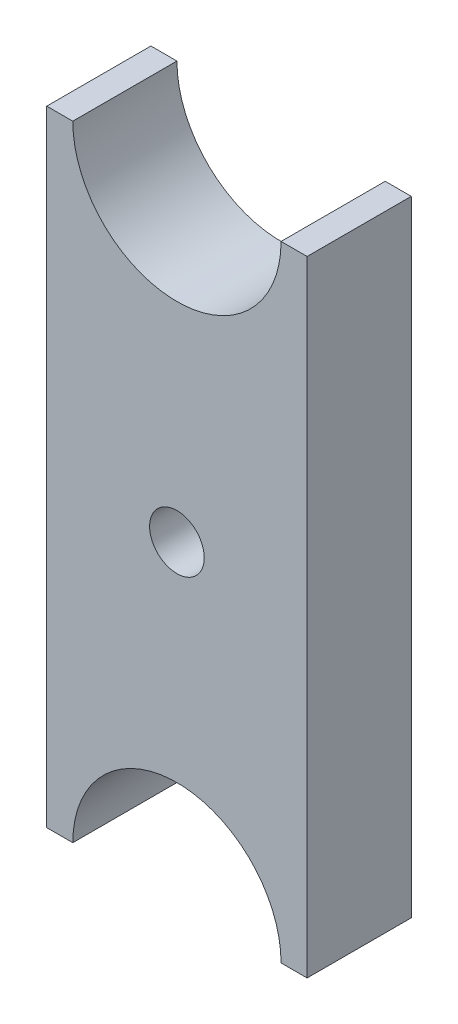
ISO-10303-21;
HEADER;
FILE_DESCRIPTION(('STEP AP214'),'2;1');
FILE_NAME('part.step','',(''),(''),'','','');
FILE_SCHEMA(('AUTOMOTIVE_DESIGN { 1 0 10303 214 1 1 1 1 }'));
ENDSEC;
DATA;
#1=APPLICATION_CONTEXT('core data for automotive mechanical design processes');
#2=APPLICATION_PROTOCOL_DEFINITION('international standard','automotive_design',2000,#1);
#3=PRODUCT_CONTEXT('',#1,'mechanical');
#4=PRODUCT('Part','Part','',(#3));
#5=PRODUCT_RELATED_PRODUCT_CATEGORY('part','',(#4));
#6=PRODUCT_DEFINITION_FORMATION('','',#4);
#7=PRODUCT_DEFINITION_CONTEXT('part definition',#1,'design');
#8=PRODUCT_DEFINITION('design','',#6,#7);
#9=PRODUCT_DEFINITION_SHAPE('','',#8);
#10=(LENGTH_UNIT() NAMED_UNIT(*) SI_UNIT(.MILLI.,.METRE.));
#11=(NAMED_UNIT(*) PLANE_ANGLE_UNIT() SI_UNIT($,.RADIAN.));
#12=(NAMED_UNIT(*) SI_UNIT($,.STERADIAN.) SOLID_ANGLE_UNIT());
#13=UNCERTAINTY_MEASURE_WITH_UNIT(LENGTH_MEASURE(1.E-05),#10,'distance_accuracy_value','');
#14=(GEOMETRIC_REPRESENTATION_CONTEXT(3) GLOBAL_UNCERTAINTY_ASSIGNED_CONTEXT((#13)) GLOBAL_UNIT_ASSIGNED_CONTEXT((#10,
#11,#12)) REPRESENTATION_CONTEXT('',''));
#15=CARTESIAN_POINT('',(0.,0.,0.));
#16=DIRECTION('',(0.,0.,1.));
#17=DIRECTION('',(1.,0.,0.));
#18=AXIS2_PLACEMENT_3D('',#15,#16,#17);
#19=CARTESIAN_POINT('',(0.,60.,20.));
#20=DIRECTION('',(0.,0.,-1.));
#21=DIRECTION('',(-1.,0.,0.));
#22=AXIS2_PLACEMENT_3D('',#19,#20,#21);
#23=PLANE('',#22);
#24=DIRECTION('',(1.,0.,0.));
#25=VECTOR('',#24,1.);
#26=CARTESIAN_POINT('',(20.,-60.,20.));
#27=LINE('',#26,#25);
#28=CARTESIAN_POINT('',(20.,-60.,20.));
#29=VERTEX_POINT('',#28);
#30=CARTESIAN_POINT('',(25.,-60.,20.));
#31=VERTEX_POINT('',#30);
#32=EDGE_CURVE('E167',#29,#31,#27,.T.);
#33=ORIENTED_EDGE('',*,*,#32,.T.);
#34=DIRECTION('',(0.,1.,0.));
#35=VECTOR('',#34,1.);
#36=CARTESIAN_POINT('',(25.,60.,20.));
#37=LINE('',#36,#35);
#38=CARTESIAN_POINT('',(25.,60.,20.));
#39=VERTEX_POINT('',#38);
#40=EDGE_CURVE('E103',#31,#39,#37,.T.);
#41=ORIENTED_EDGE('',*,*,#40,.T.);
#42=DIRECTION('',(-1.,0.,0.));
#43=VECTOR('',#42,1.);
#44=CARTESIAN_POINT('',(20.,60.,20.));
#45=LINE('',#44,#43);
#46=CARTESIAN_POINT('',(20.,60.,20.));
#47=VERTEX_POINT('',#46);
#48=EDGE_CURVE('E188',#39,#47,#45,.T.);
#49=ORIENTED_EDGE('',*,*,#48,.T.);
#50=CARTESIAN_POINT('',(0.,60.,20.));
#51=DIRECTION('',(0.,0.,-1.));
#52=DIRECTION('',(-1.,0.,0.));
#53=AXIS2_PLACEMENT_3D('',#50,#51,#52);
#54=CIRCLE('',#53,20.);
#55=CARTESIAN_POINT('',(-20.,60.,20.));
#56=VERTEX_POINT('',#55);
#57=EDGE_CURVE('E202',#47,#56,#54,.T.);
#58=ORIENTED_EDGE('',*,*,#57,.T.);
#59=DIRECTION('',(-1.,0.,0.));
#60=VECTOR('',#59,1.);
#61=CARTESIAN_POINT('',(-25.,60.,20.));
#62=LINE('',#61,#60);
#63=CARTESIAN_POINT('',(-25.,60.,20.));
#64=VERTEX_POINT('',#63);
#65=EDGE_CURVE('E122',#56,#64,#62,.T.);
#66=ORIENTED_EDGE('',*,*,#65,.T.);
#67=DIRECTION('',(0.,-1.,0.));
#68=VECTOR('',#67,1.);
#69=CARTESIAN_POINT('',(-25.,60.,20.));
#70=LINE('',#69,#68);
#71=CARTESIAN_POINT('',(-25.,-60.,20.));
#72=VERTEX_POINT('',#71);
#73=EDGE_CURVE('E116',#64,#72,#70,.T.);
#74=ORIENTED_EDGE('',*,*,#73,.T.);
#75=DIRECTION('',(1.,0.,0.));
#76=VECTOR('',#75,1.);
#77=CARTESIAN_POINT('',(-25.,-60.,20.));
#78=LINE('',#77,#76);
#79=CARTESIAN_POINT('',(-20.,-60.,20.));
#80=VERTEX_POINT('',#79);
#81=EDGE_CURVE('E120',#72,#80,#78,.T.);
#82=ORIENTED_EDGE('',*,*,#81,.T.);
#83=CARTESIAN_POINT('',(0.,-60.,20.));
#84=DIRECTION('',(0.,0.,-1.));
#85=DIRECTION('',(1.,0.,0.));
#86=AXIS2_PLACEMENT_3D('',#83,#84,#85);
#87=CIRCLE('',#86,20.);
#88=EDGE_CURVE('E60',#80,#29,#87,.T.);
#89=ORIENTED_EDGE('',*,*,#88,.T.);
#90=EDGE_LOOP('',(#33,#41,#49,#58,#66,#74,#82,#89));
#91=FACE_BOUND('',#90,.T.);
#92=CARTESIAN_POINT('',(0.,0.,20.));
#93=DIRECTION('',(0.,0.,1.));
#94=DIRECTION('',(1.,0.,0.));
#95=AXIS2_PLACEMENT_3D('',#92,#93,#94);
#96=CIRCLE('',#95,5.25);
#97=CARTESIAN_POINT('',(5.25,0.,20.));
#98=VERTEX_POINT('',#97);
#99=EDGE_CURVE('E149',#98,#98,#96,.T.);
#100=ORIENTED_EDGE('',*,*,#99,.F.);
#101=EDGE_LOOP('',(#100));
#102=FACE_BOUND('',#101,.T.);
#103=ADVANCED_FACE('F42',(#91,#102),#23,.F.);
#104=CARTESIAN_POINT('',(0.,60.,0.));
#105=DIRECTION('',(0.,0.,-1.));
#106=DIRECTION('',(-1.,0.,0.));
#107=AXIS2_PLACEMENT_3D('',#104,#105,#106);
#108=PLANE('',#107);
#109=DIRECTION('',(1.,0.,0.));
#110=VECTOR('',#109,1.);
#111=CARTESIAN_POINT('',(20.,-60.,0.));
#112=LINE('',#111,#110);
#113=CARTESIAN_POINT('',(20.,-60.,0.));
#114=VERTEX_POINT('',#113);
#115=CARTESIAN_POINT('',(25.,-60.,0.));
#116=VERTEX_POINT('',#115);
#117=EDGE_CURVE('E144',#114,#116,#112,.T.);
#118=ORIENTED_EDGE('',*,*,#117,.F.);
#119=CARTESIAN_POINT('',(0.,-60.,0.));
#120=DIRECTION('',(0.,0.,-1.));
#121=DIRECTION('',(1.,0.,0.));
#122=AXIS2_PLACEMENT_3D('',#119,#120,#121);
#123=CIRCLE('',#122,20.);
#124=CARTESIAN_POINT('',(-20.,-60.,0.));
#125=VERTEX_POINT('',#124);
#126=EDGE_CURVE('E95',#125,#114,#123,.T.);
#127=ORIENTED_EDGE('',*,*,#126,.F.);
#128=DIRECTION('',(1.,0.,0.));
#129=VECTOR('',#128,1.);
#130=CARTESIAN_POINT('',(-25.,-60.,0.));
#131=LINE('',#130,#129);
#132=CARTESIAN_POINT('',(-25.,-60.,0.));
#133=VERTEX_POINT('',#132);
#134=EDGE_CURVE('E89',#133,#125,#131,.T.);
#135=ORIENTED_EDGE('',*,*,#134,.F.);
#136=DIRECTION('',(0.,-1.,0.));
#137=VECTOR('',#136,1.);
#138=CARTESIAN_POINT('',(-25.,60.,0.));
#139=LINE('',#138,#137);
#140=CARTESIAN_POINT('',(-25.,60.,0.));
#141=VERTEX_POINT('',#140);
#142=EDGE_CURVE('E131',#141,#133,#139,.T.);
#143=ORIENTED_EDGE('',*,*,#142,.F.);
#144=DIRECTION('',(-1.,0.,0.));
#145=VECTOR('',#144,1.);
#146=CARTESIAN_POINT('',(-25.,60.,0.));
#147=LINE('',#146,#145);
#148=CARTESIAN_POINT('',(-20.,60.,0.));
#149=VERTEX_POINT('',#148);
#150=EDGE_CURVE('E158',#149,#141,#147,.T.);
#151=ORIENTED_EDGE('',*,*,#150,.F.);
#152=CARTESIAN_POINT('',(0.,60.,0.));
#153=DIRECTION('',(0.,0.,-1.));
#154=DIRECTION('',(-1.,0.,0.));
#155=AXIS2_PLACEMENT_3D('',#152,#153,#154);
#156=CIRCLE('',#155,20.);
#157=CARTESIAN_POINT('',(20.,60.,0.));
#158=VERTEX_POINT('',#157);
#159=EDGE_CURVE('E155',#158,#149,#156,.T.);
#160=ORIENTED_EDGE('',*,*,#159,.F.);
#161=DIRECTION('',(-1.,0.,0.));
#162=VECTOR('',#161,1.);
#163=CARTESIAN_POINT('',(20.,60.,0.));
#164=LINE('',#163,#162);
#165=CARTESIAN_POINT('',(25.,60.,0.));
#166=VERTEX_POINT('',#165);
#167=EDGE_CURVE('E152',#166,#158,#164,.T.);
#168=ORIENTED_EDGE('',*,*,#167,.F.);
#169=DIRECTION('',(0.,1.,0.));
#170=VECTOR('',#169,1.);
#171=CARTESIAN_POINT('',(25.,60.,0.));
#172=LINE('',#171,#170);
#173=EDGE_CURVE('E148',#116,#166,#172,.T.);
#174=ORIENTED_EDGE('',*,*,#173,.F.);
#175=EDGE_LOOP('',(#118,#127,#135,#143,#151,#160,#168,#174));
#176=FACE_BOUND('',#175,.T.);
#177=CARTESIAN_POINT('',(0.,0.,0.));
#178=DIRECTION('',(0.,0.,1.));
#179=DIRECTION('',(1.,0.,0.));
#180=AXIS2_PLACEMENT_3D('',#177,#178,#179);
#181=CIRCLE('',#180,5.25);
#182=CARTESIAN_POINT('',(5.25,0.,0.));
#183=VERTEX_POINT('',#182);
#184=EDGE_CURVE('E212',#183,#183,#181,.T.);
#185=ORIENTED_EDGE('',*,*,#184,.T.);
#186=EDGE_LOOP('',(#185));
#187=FACE_BOUND('',#186,.T.);
#188=ADVANCED_FACE('F192',(#176,#187),#108,.T.);
#189=CARTESIAN_POINT('',(20.,-60.,20.));
#190=DIRECTION('',(0.,1.,0.));
#191=DIRECTION('',(0.,0.,1.));
#192=AXIS2_PLACEMENT_3D('',#189,#190,#191);
#193=PLANE('',#192);
#194=ORIENTED_EDGE('',*,*,#117,.T.);
#195=DIRECTION('',(0.,0.,-1.));
#196=VECTOR('',#195,1.);
#197=CARTESIAN_POINT('',(25.,-60.,20.));
#198=LINE('',#197,#196);
#199=EDGE_CURVE('E11',#31,#116,#198,.T.);
#200=ORIENTED_EDGE('',*,*,#199,.F.);
#201=ORIENTED_EDGE('',*,*,#32,.F.);
#202=DIRECTION('',(0.,0.,-1.));
#203=VECTOR('',#202,1.);
#204=CARTESIAN_POINT('',(20.,-60.,20.));
#205=LINE('',#204,#203);
#206=EDGE_CURVE('E140',#29,#114,#205,.T.);
#207=ORIENTED_EDGE('',*,*,#206,.T.);
#208=EDGE_LOOP('',(#194,#200,#201,#207));
#209=FACE_BOUND('',#208,.T.);
#210=ADVANCED_FACE('F44',(#209),#193,.F.);
#211=CARTESIAN_POINT('',(25.,60.,20.));
#212=DIRECTION('',(-1.,0.,0.));
#213=DIRECTION('',(0.,-1.,0.));
#214=AXIS2_PLACEMENT_3D('',#211,#212,#213);
#215=PLANE('',#214);
#216=ORIENTED_EDGE('',*,*,#173,.T.);
#217=DIRECTION('',(0.,0.,-1.));
#218=VECTOR('',#217,1.);
#219=CARTESIAN_POINT('',(25.,60.,20.));
#220=LINE('',#219,#218);
#221=EDGE_CURVE('E52',#39,#166,#220,.T.);
#222=ORIENTED_EDGE('',*,*,#221,.F.);
#223=ORIENTED_EDGE('',*,*,#40,.F.);
#224=ORIENTED_EDGE('',*,*,#199,.T.);
#225=EDGE_LOOP('',(#216,#222,#223,#224));
#226=FACE_BOUND('',#225,.T.);
#227=ADVANCED_FACE('F242',(#226),#215,.F.);
#228=CARTESIAN_POINT('',(20.,60.,20.));
#229=DIRECTION('',(0.,-1.,0.));
#230=DIRECTION('',(0.,0.,-1.));
#231=AXIS2_PLACEMENT_3D('',#228,#229,#230);
#232=PLANE('',#231);
#233=ORIENTED_EDGE('',*,*,#167,.T.);
#234=DIRECTION('',(0.,0.,-1.));
#235=VECTOR('',#234,1.);
#236=CARTESIAN_POINT('',(20.,60.,20.));
#237=LINE('',#236,#235);
#238=EDGE_CURVE('E178',#47,#158,#237,.T.);
#239=ORIENTED_EDGE('',*,*,#238,.F.);
#240=ORIENTED_EDGE('',*,*,#48,.F.);
#241=ORIENTED_EDGE('',*,*,#221,.T.);
#242=EDGE_LOOP('',(#233,#239,#240,#241));
#243=FACE_BOUND('',#242,.T.);
#244=ADVANCED_FACE('F186',(#243),#232,.F.);
#245=CARTESIAN_POINT('',(0.,60.,20.));
#246=DIRECTION('',(0.,0.,-1.));
#247=DIRECTION('',(-1.,0.,0.));
#248=AXIS2_PLACEMENT_3D('',#245,#246,#247);
#249=CYLINDRICAL_SURFACE('',#248,20.);
#250=ORIENTED_EDGE('',*,*,#159,.T.);
#251=DIRECTION('',(0.,0.,-1.));
#252=VECTOR('',#251,1.);
#253=CARTESIAN_POINT('',(-20.,60.,20.));
#254=LINE('',#253,#252);
#255=EDGE_CURVE('E174',#56,#149,#254,.T.);
#256=ORIENTED_EDGE('',*,*,#255,.F.);
#257=ORIENTED_EDGE('',*,*,#57,.F.);
#258=ORIENTED_EDGE('',*,*,#238,.T.);
#259=EDGE_LOOP('',(#250,#256,#257,#258));
#260=FACE_BOUND('',#259,.T.);
#261=ADVANCED_FACE('F197',(#260),#249,.F.);
#262=CARTESIAN_POINT('',(-25.,60.,20.));
#263=DIRECTION('',(0.,-1.,0.));
#264=DIRECTION('',(0.,0.,-1.));
#265=AXIS2_PLACEMENT_3D('',#262,#263,#264);
#266=PLANE('',#265);
#267=ORIENTED_EDGE('',*,*,#150,.T.);
#268=DIRECTION('',(0.,0.,-1.));
#269=VECTOR('',#268,1.);
#270=CARTESIAN_POINT('',(-25.,60.,20.));
#271=LINE('',#270,#269);
#272=EDGE_CURVE('E133',#64,#141,#271,.T.);
#273=ORIENTED_EDGE('',*,*,#272,.F.);
#274=ORIENTED_EDGE('',*,*,#65,.F.);
#275=ORIENTED_EDGE('',*,*,#255,.T.);
#276=EDGE_LOOP('',(#267,#273,#274,#275));
#277=FACE_BOUND('',#276,.T.);
#278=ADVANCED_FACE('F200',(#277),#266,.F.);
#279=CARTESIAN_POINT('',(-25.,60.,20.));
#280=DIRECTION('',(1.,0.,0.));
#281=DIRECTION('',(0.,1.,0.));
#282=AXIS2_PLACEMENT_3D('',#279,#280,#281);
#283=PLANE('',#282);
#284=ORIENTED_EDGE('',*,*,#142,.T.);
#285=DIRECTION('',(0.,0.,-1.));
#286=VECTOR('',#285,1.);
#287=CARTESIAN_POINT('',(-25.,-60.,20.));
#288=LINE('',#287,#286);
#289=EDGE_CURVE('E128',#72,#133,#288,.T.);
#290=ORIENTED_EDGE('',*,*,#289,.F.);
#291=ORIENTED_EDGE('',*,*,#73,.F.);
#292=ORIENTED_EDGE('',*,*,#272,.T.);
#293=EDGE_LOOP('',(#284,#290,#291,#292));
#294=FACE_BOUND('',#293,.T.);
#295=ADVANCED_FACE('F129',(#294),#283,.F.);
#296=CARTESIAN_POINT('',(-25.,-60.,20.));
#297=DIRECTION('',(0.,1.,0.));
#298=DIRECTION('',(0.,0.,1.));
#299=AXIS2_PLACEMENT_3D('',#296,#297,#298);
#300=PLANE('',#299);
#301=ORIENTED_EDGE('',*,*,#134,.T.);
#302=DIRECTION('',(0.,0.,-1.));
#303=VECTOR('',#302,1.);
#304=CARTESIAN_POINT('',(-20.,-60.,20.));
#305=LINE('',#304,#303);
#306=EDGE_CURVE('E134',#80,#125,#305,.T.);
#307=ORIENTED_EDGE('',*,*,#306,.F.);
#308=ORIENTED_EDGE('',*,*,#81,.F.);
#309=ORIENTED_EDGE('',*,*,#289,.T.);
#310=EDGE_LOOP('',(#301,#307,#308,#309));
#311=FACE_BOUND('',#310,.T.);
#312=ADVANCED_FACE('F136',(#311),#300,.F.);
#313=CARTESIAN_POINT('',(0.,-60.,20.));
#314=DIRECTION('',(0.,0.,-1.));
#315=DIRECTION('',(-1.,0.,0.));
#316=AXIS2_PLACEMENT_3D('',#313,#314,#315);
#317=CYLINDRICAL_SURFACE('',#316,20.);
#318=ORIENTED_EDGE('',*,*,#126,.T.);
#319=ORIENTED_EDGE('',*,*,#206,.F.);
#320=ORIENTED_EDGE('',*,*,#88,.F.);
#321=ORIENTED_EDGE('',*,*,#306,.T.);
#322=EDGE_LOOP('',(#318,#319,#320,#321));
#323=FACE_BOUND('',#322,.T.);
#324=ADVANCED_FACE('F230',(#323),#317,.F.);
#325=CARTESIAN_POINT('',(0.,0.,20.));
#326=DIRECTION('',(0.,0.,-1.));
#327=DIRECTION('',(-1.,0.,0.));
#328=AXIS2_PLACEMENT_3D('',#325,#326,#327);
#329=CYLINDRICAL_SURFACE('',#328,5.25);
#330=ORIENTED_EDGE('',*,*,#99,.T.);
#331=EDGE_LOOP('',(#330));
#332=FACE_BOUND('',#331,.T.);
#333=ORIENTED_EDGE('',*,*,#184,.F.);
#334=EDGE_LOOP('',(#333));
#335=FACE_BOUND('',#334,.T.);
#336=ADVANCED_FACE('F220',(#332,#335),#329,.F.);
#337=CLOSED_SHELL('',(#103,#188,#210,#227,#244,#261,#278,#295,#312,#324,#336));
#338=MANIFOLD_SOLID_BREP('B2',#337);
#339=ADVANCED_BREP_SHAPE_REPRESENTATION('',(#18,#338),#14);
#340=SHAPE_DEFINITION_REPRESENTATION(#9,#339);
ENDSEC;
END-ISO-10303-21;
